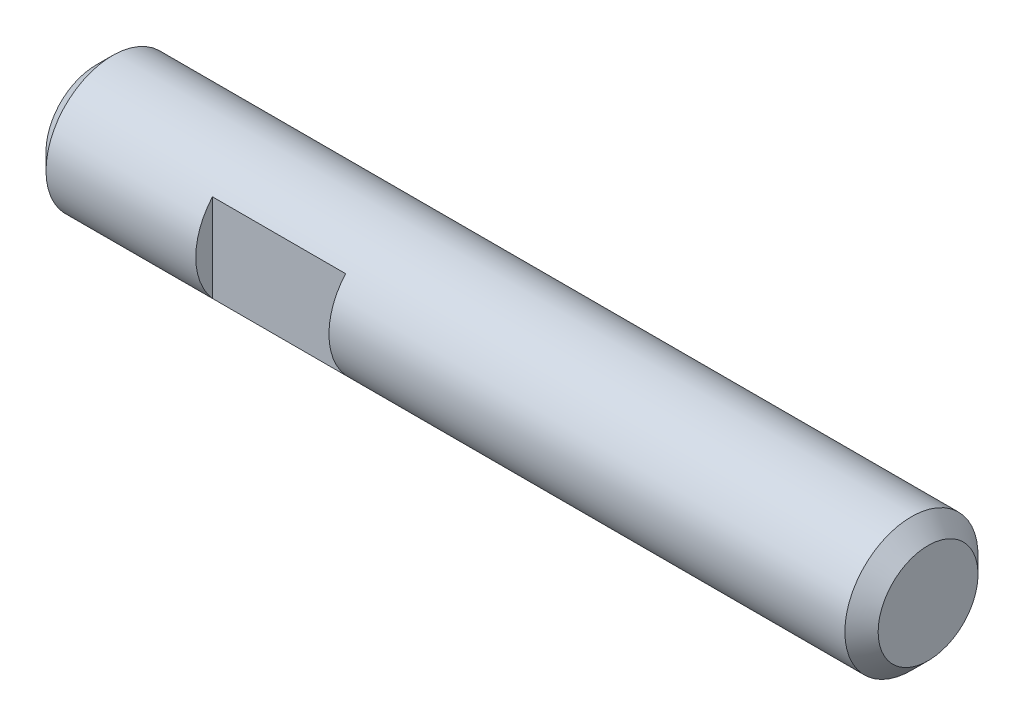
ISO-10303-21;
HEADER;
FILE_DESCRIPTION(('STEP AP214'),'2;1');
FILE_NAME('part.step','',(''),(''),'','','');
FILE_SCHEMA(('AUTOMOTIVE_DESIGN { 1 0 10303 214 1 1 1 1 }'));
ENDSEC;
DATA;
#1=APPLICATION_CONTEXT('core data for automotive mechanical design processes');
#2=APPLICATION_PROTOCOL_DEFINITION('international standard','automotive_design',2000,#1);
#3=PRODUCT_CONTEXT('',#1,'mechanical');
#4=PRODUCT('Part','Part','',(#3));
#5=PRODUCT_RELATED_PRODUCT_CATEGORY('part','',(#4));
#6=PRODUCT_DEFINITION_FORMATION('','',#4);
#7=PRODUCT_DEFINITION_CONTEXT('part definition',#1,'design');
#8=PRODUCT_DEFINITION('design','',#6,#7);
#9=PRODUCT_DEFINITION_SHAPE('','',#8);
#10=(LENGTH_UNIT() NAMED_UNIT(*) SI_UNIT(.MILLI.,.METRE.));
#11=(NAMED_UNIT(*) PLANE_ANGLE_UNIT() SI_UNIT($,.RADIAN.));
#12=(NAMED_UNIT(*) SI_UNIT($,.STERADIAN.) SOLID_ANGLE_UNIT());
#13=UNCERTAINTY_MEASURE_WITH_UNIT(LENGTH_MEASURE(1.E-05),#10,'distance_accuracy_value','');
#14=(GEOMETRIC_REPRESENTATION_CONTEXT(3) GLOBAL_UNCERTAINTY_ASSIGNED_CONTEXT((#13)) GLOBAL_UNIT_ASSIGNED_CONTEXT((#10,
#11,#12)) REPRESENTATION_CONTEXT('',''));
#15=CARTESIAN_POINT('',(0.,0.,0.));
#16=DIRECTION('',(0.,0.,1.));
#17=DIRECTION('',(1.,0.,0.));
#18=AXIS2_PLACEMENT_3D('',#15,#16,#17);
#19=CARTESIAN_POINT('',(25.,0.,0.));
#20=DIRECTION('',(-1.,0.,0.));
#21=DIRECTION('',(0.,0.,1.));
#22=AXIS2_PLACEMENT_3D('',#19,#20,#21);
#23=CYLINDRICAL_SURFACE('',#22,2.);
#24=CARTESIAN_POINT('',(24.5,0.,0.));
#25=DIRECTION('',(-1.,0.,0.));
#26=DIRECTION('',(0.,0.,1.));
#27=AXIS2_PLACEMENT_3D('',#24,#25,#26);
#28=CIRCLE('',#27,2.);
#29=CARTESIAN_POINT('',(24.5,0.,2.));
#30=VERTEX_POINT('',#29);
#31=EDGE_CURVE('E82',#30,#30,#28,.T.);
#32=ORIENTED_EDGE('',*,*,#31,.T.);
#33=EDGE_LOOP('',(#32));
#34=FACE_BOUND('',#33,.T.);
#35=CARTESIAN_POINT('',(0.5,0.,0.));
#36=DIRECTION('',(-1.,0.,0.));
#37=DIRECTION('',(0.,0.,1.));
#38=AXIS2_PLACEMENT_3D('',#35,#36,#37);
#39=CIRCLE('',#38,2.);
#40=CARTESIAN_POINT('',(0.5,0.,2.));
#41=VERTEX_POINT('',#40);
#42=EDGE_CURVE('E79',#41,#41,#39,.T.);
#43=ORIENTED_EDGE('',*,*,#42,.F.);
#44=EDGE_LOOP('',(#43));
#45=FACE_BOUND('',#44,.T.);
#46=CARTESIAN_POINT('',(5.,0.,0.));
#47=DIRECTION('',(1.,0.,0.));
#48=DIRECTION('',(0.,0.,-1.));
#49=AXIS2_PLACEMENT_3D('',#46,#47,#48);
#50=CIRCLE('',#49,2.);
#51=CARTESIAN_POINT('',(5.,1.3228756555323,1.5));
#52=VERTEX_POINT('',#51);
#53=CARTESIAN_POINT('',(5.,-1.3228756555323,1.5));
#54=VERTEX_POINT('',#53);
#55=EDGE_CURVE('E11',#52,#54,#50,.T.);
#56=ORIENTED_EDGE('',*,*,#55,.F.);
#57=DIRECTION('',(-1.,0.,0.));
#58=VECTOR('',#57,1.);
#59=CARTESIAN_POINT('',(25.,1.3228756555323,1.5));
#60=LINE('',#59,#58);
#61=CARTESIAN_POINT('',(9.,1.3228756555323,1.5));
#62=VERTEX_POINT('',#61);
#63=EDGE_CURVE('E45',#62,#52,#60,.T.);
#64=ORIENTED_EDGE('',*,*,#63,.F.);
#65=CARTESIAN_POINT('',(9.,0.,0.));
#66=DIRECTION('',(-1.,0.,0.));
#67=DIRECTION('',(0.,0.,1.));
#68=AXIS2_PLACEMENT_3D('',#65,#66,#67);
#69=CIRCLE('',#68,2.);
#70=CARTESIAN_POINT('',(9.,-1.3228756555323,1.5));
#71=VERTEX_POINT('',#70);
#72=EDGE_CURVE('E62',#71,#62,#69,.T.);
#73=ORIENTED_EDGE('',*,*,#72,.F.);
#74=DIRECTION('',(-1.,0.,0.));
#75=VECTOR('',#74,1.);
#76=CARTESIAN_POINT('',(25.,-1.3228756555323,1.5));
#77=LINE('',#76,#75);
#78=EDGE_CURVE('E67',#54,#71,#77,.F.);
#79=ORIENTED_EDGE('',*,*,#78,.F.);
#80=EDGE_LOOP('',(#56,#64,#73,#79));
#81=FACE_BOUND('',#80,.T.);
#82=ADVANCED_FACE('F37',(#34,#45,#81),#23,.T.);
#83=CARTESIAN_POINT('',(0.,0.,0.));
#84=DIRECTION('',(1.,0.,0.));
#85=DIRECTION('',(0.,0.,-1.));
#86=AXIS2_PLACEMENT_3D('',#83,#84,#85);
#87=PLANE('',#86);
#88=CARTESIAN_POINT('',(0.,0.,0.));
#89=DIRECTION('',(-1.,0.,0.));
#90=DIRECTION('',(0.,0.,1.));
#91=AXIS2_PLACEMENT_3D('',#88,#89,#90);
#92=CIRCLE('',#91,1.5);
#93=CARTESIAN_POINT('',(0.,0.,1.5));
#94=VERTEX_POINT('',#93);
#95=EDGE_CURVE('E68',#94,#94,#92,.T.);
#96=ORIENTED_EDGE('',*,*,#95,.T.);
#97=EDGE_LOOP('',(#96));
#98=FACE_BOUND('',#97,.T.);
#99=ADVANCED_FACE('F39',(#98),#87,.F.);
#100=CARTESIAN_POINT('',(0.5,0.,0.));
#101=DIRECTION('',(1.,0.,0.));
#102=DIRECTION('',(0.,0.,-1.));
#103=AXIS2_PLACEMENT_3D('',#100,#101,#102);
#104=CONICAL_SURFACE('',#103,2.,0.785398163397448);
#105=ORIENTED_EDGE('',*,*,#95,.F.);
#106=EDGE_LOOP('',(#105));
#107=FACE_BOUND('',#106,.T.);
#108=ORIENTED_EDGE('',*,*,#42,.T.);
#109=EDGE_LOOP('',(#108));
#110=FACE_BOUND('',#109,.T.);
#111=ADVANCED_FACE('F104',(#107,#110),#104,.T.);
#112=CARTESIAN_POINT('',(25.,0.,0.));
#113=DIRECTION('',(-1.,0.,0.));
#114=DIRECTION('',(0.,0.,1.));
#115=AXIS2_PLACEMENT_3D('',#112,#113,#114);
#116=CONICAL_SURFACE('',#115,1.5,0.785398163397448);
#117=ORIENTED_EDGE('',*,*,#31,.F.);
#118=EDGE_LOOP('',(#117));
#119=FACE_BOUND('',#118,.T.);
#120=CARTESIAN_POINT('',(25.,0.,0.));
#121=DIRECTION('',(-1.,0.,0.));
#122=DIRECTION('',(0.,0.,1.));
#123=AXIS2_PLACEMENT_3D('',#120,#121,#122);
#124=CIRCLE('',#123,1.5);
#125=CARTESIAN_POINT('',(25.,0.,1.5));
#126=VERTEX_POINT('',#125);
#127=EDGE_CURVE('E85',#126,#126,#124,.T.);
#128=ORIENTED_EDGE('',*,*,#127,.T.);
#129=EDGE_LOOP('',(#128));
#130=FACE_BOUND('',#129,.T.);
#131=ADVANCED_FACE('F108',(#119,#130),#116,.T.);
#132=CARTESIAN_POINT('',(25.,1.5,0.));
#133=DIRECTION('',(-1.,0.,0.));
#134=DIRECTION('',(0.,0.,1.));
#135=AXIS2_PLACEMENT_3D('',#132,#133,#134);
#136=PLANE('',#135);
#137=ORIENTED_EDGE('',*,*,#127,.F.);
#138=EDGE_LOOP('',(#137));
#139=FACE_BOUND('',#138,.T.);
#140=ADVANCED_FACE('F96',(#139),#136,.F.);
#141=CARTESIAN_POINT('',(9.,4.,1.5));
#142=DIRECTION('',(0.,0.,1.));
#143=DIRECTION('',(1.,0.,0.));
#144=AXIS2_PLACEMENT_3D('',#141,#142,#143);
#145=PLANE('',#144);
#146=ORIENTED_EDGE('',*,*,#63,.T.);
#147=DIRECTION('',(0.,-1.,0.));
#148=VECTOR('',#147,1.);
#149=CARTESIAN_POINT('',(5.,4.,1.5));
#150=LINE('',#149,#148);
#151=EDGE_CURVE('E73',#52,#54,#150,.T.);
#152=ORIENTED_EDGE('',*,*,#151,.T.);
#153=ORIENTED_EDGE('',*,*,#78,.T.);
#154=DIRECTION('',(0.,-1.,0.));
#155=VECTOR('',#154,1.);
#156=CARTESIAN_POINT('',(9.,4.,1.5));
#157=LINE('',#156,#155);
#158=EDGE_CURVE('E51',#62,#71,#157,.T.);
#159=ORIENTED_EDGE('',*,*,#158,.F.);
#160=EDGE_LOOP('',(#146,#152,#153,#159));
#161=FACE_BOUND('',#160,.T.);
#162=ADVANCED_FACE('F72',(#161),#145,.T.);
#163=CARTESIAN_POINT('',(5.,4.,1.5));
#164=DIRECTION('',(1.,0.,0.));
#165=DIRECTION('',(0.,0.,-1.));
#166=AXIS2_PLACEMENT_3D('',#163,#164,#165);
#167=PLANE('',#166);
#168=ORIENTED_EDGE('',*,*,#151,.F.);
#169=ORIENTED_EDGE('',*,*,#55,.T.);
#170=EDGE_LOOP('',(#168,#169));
#171=FACE_BOUND('',#170,.T.);
#172=ADVANCED_FACE('F88',(#171),#167,.T.);
#173=CARTESIAN_POINT('',(9.,4.,2.));
#174=DIRECTION('',(-1.,0.,0.));
#175=DIRECTION('',(0.,0.,1.));
#176=AXIS2_PLACEMENT_3D('',#173,#174,#175);
#177=PLANE('',#176);
#178=ORIENTED_EDGE('',*,*,#72,.T.);
#179=ORIENTED_EDGE('',*,*,#158,.T.);
#180=EDGE_LOOP('',(#178,#179));
#181=FACE_BOUND('',#180,.T.);
#182=ADVANCED_FACE('F63',(#181),#177,.T.);
#183=CLOSED_SHELL('',(#82,#99,#111,#131,#140,#162,#172,#182));
#184=MANIFOLD_SOLID_BREP('B2',#183);
#185=ADVANCED_BREP_SHAPE_REPRESENTATION('',(#18,#184),#14);
#186=SHAPE_DEFINITION_REPRESENTATION(#9,#185);
ENDSEC;
END-ISO-10303-21;
